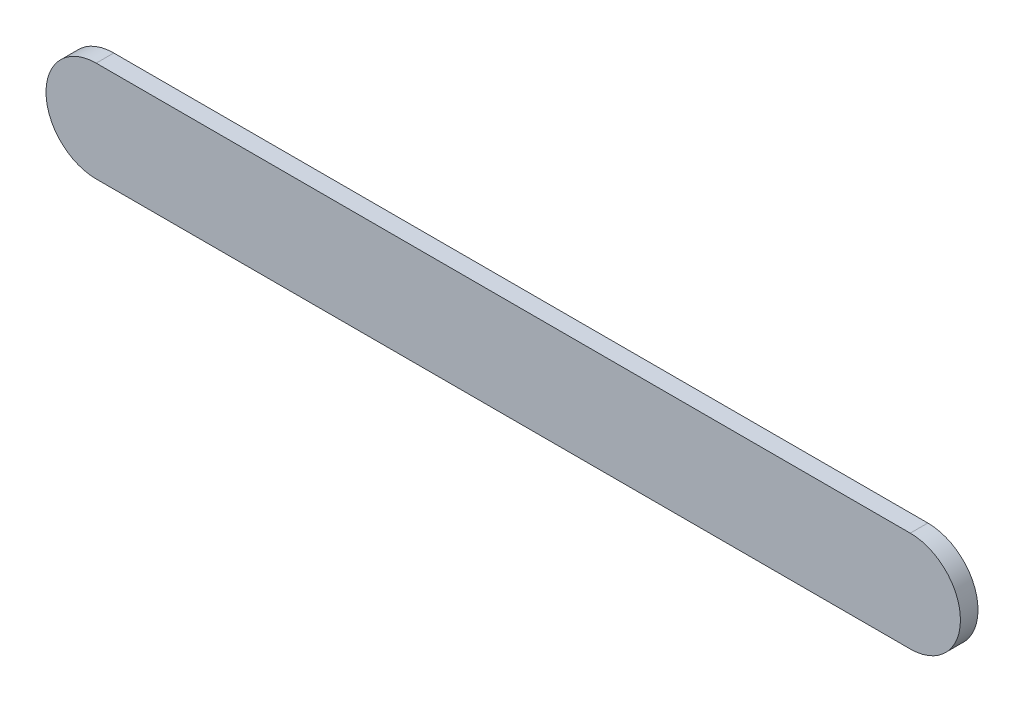
ISO-10303-21;
HEADER;
FILE_DESCRIPTION(('STEP AP214'),'2;1');
FILE_NAME('part.step','',(''),(''),'','','');
FILE_SCHEMA(('AUTOMOTIVE_DESIGN { 1 0 10303 214 1 1 1 1 }'));
ENDSEC;
DATA;
#1=APPLICATION_CONTEXT('core data for automotive mechanical design processes');
#2=APPLICATION_PROTOCOL_DEFINITION('international standard','automotive_design',2000,#1);
#3=PRODUCT_CONTEXT('',#1,'mechanical');
#4=PRODUCT('Part','Part','',(#3));
#5=PRODUCT_RELATED_PRODUCT_CATEGORY('part','',(#4));
#6=PRODUCT_DEFINITION_FORMATION('','',#4);
#7=PRODUCT_DEFINITION_CONTEXT('part definition',#1,'design');
#8=PRODUCT_DEFINITION('design','',#6,#7);
#9=PRODUCT_DEFINITION_SHAPE('','',#8);
#10=(LENGTH_UNIT() NAMED_UNIT(*) SI_UNIT(.MILLI.,.METRE.));
#11=(NAMED_UNIT(*) PLANE_ANGLE_UNIT() SI_UNIT($,.RADIAN.));
#12=(NAMED_UNIT(*) SI_UNIT($,.STERADIAN.) SOLID_ANGLE_UNIT());
#13=UNCERTAINTY_MEASURE_WITH_UNIT(LENGTH_MEASURE(1.E-05),#10,'distance_accuracy_value','');
#14=(GEOMETRIC_REPRESENTATION_CONTEXT(3) GLOBAL_UNCERTAINTY_ASSIGNED_CONTEXT((#13)) GLOBAL_UNIT_ASSIGNED_CONTEXT((#10,
#11,#12)) REPRESENTATION_CONTEXT('',''));
#15=CARTESIAN_POINT('',(0.,0.,0.));
#16=DIRECTION('',(0.,0.,1.));
#17=DIRECTION('',(1.,0.,0.));
#18=AXIS2_PLACEMENT_3D('',#15,#16,#17);
#19=CARTESIAN_POINT('',(83.84,-130.4,1.635));
#20=DIRECTION('',(0.,0.,1.));
#21=DIRECTION('',(1.,0.,0.));
#22=AXIS2_PLACEMENT_3D('',#19,#20,#21);
#23=PLANE('',#22);
#24=DIRECTION('',(1.,0.,0.));
#25=VECTOR('',#24,1.);
#26=CARTESIAN_POINT('',(83.84,-130.4,1.635));
#27=LINE('',#26,#25);
#28=CARTESIAN_POINT('',(83.84,-130.4,1.635));
#29=VERTEX_POINT('',#28);
#30=CARTESIAN_POINT('',(85.4625,-130.4,1.635));
#31=VERTEX_POINT('',#30);
#32=EDGE_CURVE('E98',#29,#31,#27,.T.);
#33=ORIENTED_EDGE('',*,*,#32,.T.);
#34=CARTESIAN_POINT('',(85.4625,-130.3,1.635));
#35=DIRECTION('',(0.,0.,1.));
#36=DIRECTION('',(2.842170943041E-13,-1.,0.));
#37=AXIS2_PLACEMENT_3D('',#34,#35,#36);
#38=CIRCLE('',#37,0.1);
#39=CARTESIAN_POINT('',(85.4625,-130.2,1.635));
#40=VERTEX_POINT('',#39);
#41=EDGE_CURVE('E77',#31,#40,#38,.T.);
#42=ORIENTED_EDGE('',*,*,#41,.T.);
#43=DIRECTION('',(-1.,0.,0.));
#44=VECTOR('',#43,1.);
#45=CARTESIAN_POINT('',(85.4625,-130.2,1.635));
#46=LINE('',#45,#44);
#47=CARTESIAN_POINT('',(83.84,-130.2,1.635));
#48=VERTEX_POINT('',#47);
#49=EDGE_CURVE('E82',#40,#48,#46,.T.);
#50=ORIENTED_EDGE('',*,*,#49,.T.);
#51=CARTESIAN_POINT('',(83.84,-130.3,1.635));
#52=DIRECTION('',(0.,0.,1.));
#53=DIRECTION('',(0.,1.,0.));
#54=AXIS2_PLACEMENT_3D('',#51,#52,#53);
#55=CIRCLE('',#54,0.1);
#56=EDGE_CURVE('E11',#48,#29,#55,.T.);
#57=ORIENTED_EDGE('',*,*,#56,.T.);
#58=EDGE_LOOP('',(#33,#42,#50,#57));
#59=FACE_BOUND('',#58,.T.);
#60=ADVANCED_FACE('F17',(#59),#23,.T.);
#61=CARTESIAN_POINT('',(83.84,-130.4,1.6));
#62=DIRECTION('',(0.,0.,1.));
#63=DIRECTION('',(1.,0.,0.));
#64=AXIS2_PLACEMENT_3D('',#61,#62,#63);
#65=PLANE('',#64);
#66=CARTESIAN_POINT('',(83.84,-130.3,1.6));
#67=DIRECTION('',(0.,0.,1.));
#68=DIRECTION('',(0.,1.,0.));
#69=AXIS2_PLACEMENT_3D('',#66,#67,#68);
#70=CIRCLE('',#69,0.1);
#71=CARTESIAN_POINT('',(83.84,-130.2,1.6));
#72=VERTEX_POINT('',#71);
#73=CARTESIAN_POINT('',(83.84,-130.4,1.6));
#74=VERTEX_POINT('',#73);
#75=EDGE_CURVE('E25',#72,#74,#70,.T.);
#76=ORIENTED_EDGE('',*,*,#75,.F.);
#77=DIRECTION('',(-1.,0.,0.));
#78=VECTOR('',#77,1.);
#79=CARTESIAN_POINT('',(85.4625,-130.2,1.6));
#80=LINE('',#79,#78);
#81=CARTESIAN_POINT('',(85.4625,-130.2,1.6));
#82=VERTEX_POINT('',#81);
#83=EDGE_CURVE('E67',#82,#72,#80,.T.);
#84=ORIENTED_EDGE('',*,*,#83,.F.);
#85=CARTESIAN_POINT('',(85.4625,-130.3,1.6));
#86=DIRECTION('',(0.,0.,1.));
#87=DIRECTION('',(2.842170943041E-13,-1.,0.));
#88=AXIS2_PLACEMENT_3D('',#85,#86,#87);
#89=CIRCLE('',#88,0.1);
#90=CARTESIAN_POINT('',(85.4625,-130.4,1.6));
#91=VERTEX_POINT('',#90);
#92=EDGE_CURVE('E71',#91,#82,#89,.T.);
#93=ORIENTED_EDGE('',*,*,#92,.F.);
#94=DIRECTION('',(1.,0.,0.));
#95=VECTOR('',#94,1.);
#96=CARTESIAN_POINT('',(83.84,-130.4,1.6));
#97=LINE('',#96,#95);
#98=EDGE_CURVE('E119',#74,#91,#97,.T.);
#99=ORIENTED_EDGE('',*,*,#98,.F.);
#100=EDGE_LOOP('',(#76,#84,#93,#99));
#101=FACE_BOUND('',#100,.T.);
#102=ADVANCED_FACE('F69',(#101),#65,.F.);
#103=CARTESIAN_POINT('',(83.84,-130.3,1.6));
#104=DIRECTION('',(0.,0.,-1.));
#105=DIRECTION('',(0.,1.,0.));
#106=AXIS2_PLACEMENT_3D('',#103,#104,#105);
#107=CYLINDRICAL_SURFACE('',#106,0.1);
#108=ORIENTED_EDGE('',*,*,#75,.T.);
#109=DIRECTION('',(0.,0.,1.));
#110=VECTOR('',#109,1.);
#111=CARTESIAN_POINT('',(83.84,-130.4,1.6));
#112=LINE('',#111,#110);
#113=EDGE_CURVE('E92',#74,#29,#112,.T.);
#114=ORIENTED_EDGE('',*,*,#113,.T.);
#115=ORIENTED_EDGE('',*,*,#56,.F.);
#116=DIRECTION('',(0.,0.,1.));
#117=VECTOR('',#116,1.);
#118=CARTESIAN_POINT('',(83.84,-130.2,1.6));
#119=LINE('',#118,#117);
#120=EDGE_CURVE('E76',#72,#48,#119,.T.);
#121=ORIENTED_EDGE('',*,*,#120,.F.);
#122=EDGE_LOOP('',(#108,#114,#115,#121));
#123=FACE_BOUND('',#122,.T.);
#124=ADVANCED_FACE('F126',(#123),#107,.T.);
#125=CARTESIAN_POINT('',(85.4625,-130.2,1.6));
#126=DIRECTION('',(0.,-1.,0.));
#127=DIRECTION('',(0.,0.,-1.));
#128=AXIS2_PLACEMENT_3D('',#125,#126,#127);
#129=PLANE('',#128);
#130=ORIENTED_EDGE('',*,*,#83,.T.);
#131=ORIENTED_EDGE('',*,*,#120,.T.);
#132=ORIENTED_EDGE('',*,*,#49,.F.);
#133=DIRECTION('',(0.,0.,1.));
#134=VECTOR('',#133,1.);
#135=CARTESIAN_POINT('',(85.4625,-130.2,1.6));
#136=LINE('',#135,#134);
#137=EDGE_CURVE('E80',#82,#40,#136,.T.);
#138=ORIENTED_EDGE('',*,*,#137,.F.);
#139=EDGE_LOOP('',(#130,#131,#132,#138));
#140=FACE_BOUND('',#139,.T.);
#141=ADVANCED_FACE('F81',(#140),#129,.F.);
#142=CARTESIAN_POINT('',(85.4625,-130.3,1.6));
#143=DIRECTION('',(0.,0.,-1.));
#144=DIRECTION('',(2.842170943041E-13,-1.,0.));
#145=AXIS2_PLACEMENT_3D('',#142,#143,#144);
#146=CYLINDRICAL_SURFACE('',#145,0.1);
#147=ORIENTED_EDGE('',*,*,#92,.T.);
#148=ORIENTED_EDGE('',*,*,#137,.T.);
#149=ORIENTED_EDGE('',*,*,#41,.F.);
#150=DIRECTION('',(0.,0.,1.));
#151=VECTOR('',#150,1.);
#152=CARTESIAN_POINT('',(85.4625,-130.4,1.6));
#153=LINE('',#152,#151);
#154=EDGE_CURVE('E89',#91,#31,#153,.T.);
#155=ORIENTED_EDGE('',*,*,#154,.F.);
#156=EDGE_LOOP('',(#147,#148,#149,#155));
#157=FACE_BOUND('',#156,.T.);
#158=ADVANCED_FACE('F87',(#157),#146,.T.);
#159=CARTESIAN_POINT('',(83.84,-130.4,1.6));
#160=DIRECTION('',(0.,1.,0.));
#161=DIRECTION('',(1.,0.,0.));
#162=AXIS2_PLACEMENT_3D('',#159,#160,#161);
#163=PLANE('',#162);
#164=ORIENTED_EDGE('',*,*,#98,.T.);
#165=ORIENTED_EDGE('',*,*,#154,.T.);
#166=ORIENTED_EDGE('',*,*,#32,.F.);
#167=ORIENTED_EDGE('',*,*,#113,.F.);
#168=EDGE_LOOP('',(#164,#165,#166,#167));
#169=FACE_BOUND('',#168,.T.);
#170=ADVANCED_FACE('F124',(#169),#163,.F.);
#171=CLOSED_SHELL('',(#60,#102,#124,#141,#158,#170));
#172=MANIFOLD_SOLID_BREP('B1',#171);
#173=ADVANCED_BREP_SHAPE_REPRESENTATION('',(#18,#172),#14);
#174=SHAPE_DEFINITION_REPRESENTATION(#9,#173);
ENDSEC;
END-ISO-10303-21;
